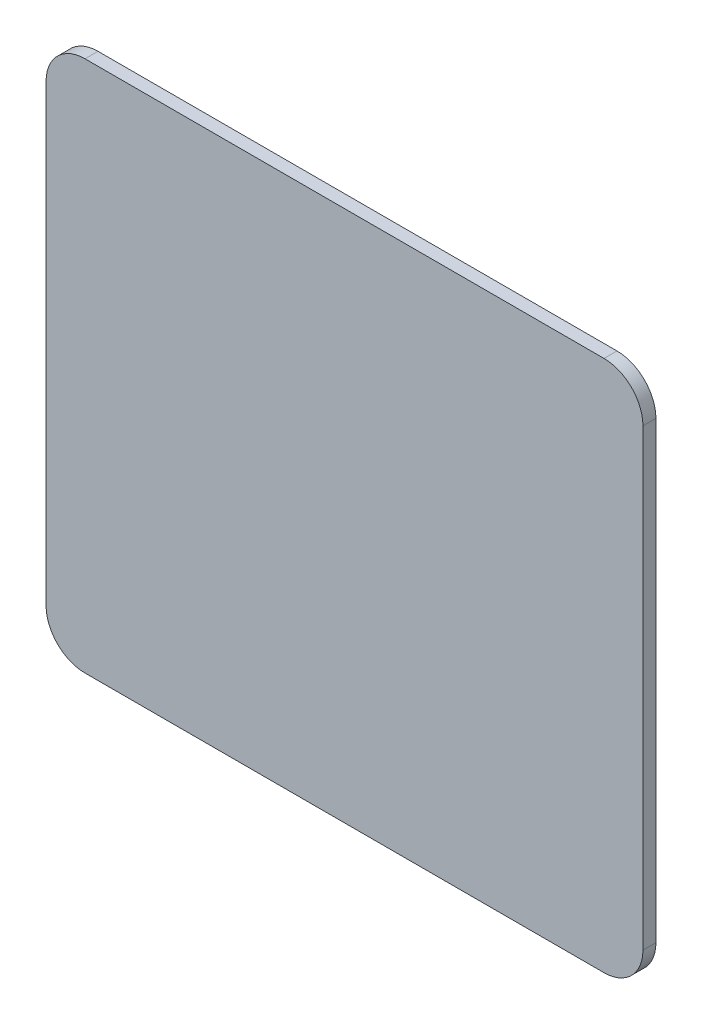
ISO-10303-21;
HEADER;
FILE_DESCRIPTION(('STEP AP214'),'2;1');
FILE_NAME('part.step','',(''),(''),'','','');
FILE_SCHEMA(('AUTOMOTIVE_DESIGN { 1 0 10303 214 1 1 1 1 }'));
ENDSEC;
DATA;
#1=APPLICATION_CONTEXT('core data for automotive mechanical design processes');
#2=APPLICATION_PROTOCOL_DEFINITION('international standard','automotive_design',2000,#1);
#3=PRODUCT_CONTEXT('',#1,'mechanical');
#4=PRODUCT('Part','Part','',(#3));
#5=PRODUCT_RELATED_PRODUCT_CATEGORY('part','',(#4));
#6=PRODUCT_DEFINITION_FORMATION('','',#4);
#7=PRODUCT_DEFINITION_CONTEXT('part definition',#1,'design');
#8=PRODUCT_DEFINITION('design','',#6,#7);
#9=PRODUCT_DEFINITION_SHAPE('','',#8);
#10=(LENGTH_UNIT() NAMED_UNIT(*) SI_UNIT(.MILLI.,.METRE.));
#11=(NAMED_UNIT(*) PLANE_ANGLE_UNIT() SI_UNIT($,.RADIAN.));
#12=(NAMED_UNIT(*) SI_UNIT($,.STERADIAN.) SOLID_ANGLE_UNIT());
#13=UNCERTAINTY_MEASURE_WITH_UNIT(LENGTH_MEASURE(1.E-05),#10,'distance_accuracy_value','');
#14=(GEOMETRIC_REPRESENTATION_CONTEXT(3) GLOBAL_UNCERTAINTY_ASSIGNED_CONTEXT((#13)) GLOBAL_UNIT_ASSIGNED_CONTEXT((#10,
#11,#12)) REPRESENTATION_CONTEXT('',''));
#15=CARTESIAN_POINT('',(0.,0.,0.));
#16=DIRECTION('',(0.,0.,1.));
#17=DIRECTION('',(1.,0.,0.));
#18=AXIS2_PLACEMENT_3D('',#15,#16,#17);
#19=CARTESIAN_POINT('',(-19.1581938186555,19.0251729813199,1.));
#20=DIRECTION('',(0.,0.,-1.));
#21=DIRECTION('',(-1.,0.,0.));
#22=AXIS2_PLACEMENT_3D('',#19,#20,#21);
#23=CYLINDRICAL_SURFACE('',#22,2.99999999999991);
#24=CARTESIAN_POINT('',(-19.1581938186555,19.0251729813199,0.));
#25=DIRECTION('',(0.,0.,1.));
#26=DIRECTION('',(-1.,0.,0.));
#27=AXIS2_PLACEMENT_3D('',#24,#25,#26);
#28=CIRCLE('',#27,2.99999999999991);
#29=CARTESIAN_POINT('',(-19.1581938186555,22.0251729813198,0.));
#30=VERTEX_POINT('',#29);
#31=CARTESIAN_POINT('',(-22.1581938186554,19.0251729813199,0.));
#32=VERTEX_POINT('',#31);
#33=EDGE_CURVE('E144',#30,#32,#28,.T.);
#34=ORIENTED_EDGE('',*,*,#33,.T.);
#35=DIRECTION('',(0.,0.,-1.));
#36=VECTOR('',#35,1.);
#37=CARTESIAN_POINT('',(-22.1581938186554,19.0251729813199,1.));
#38=LINE('',#37,#36);
#39=CARTESIAN_POINT('',(-22.1581938186554,19.0251729813199,1.));
#40=VERTEX_POINT('',#39);
#41=EDGE_CURVE('E11',#40,#32,#38,.T.);
#42=ORIENTED_EDGE('',*,*,#41,.F.);
#43=CARTESIAN_POINT('',(-19.1581938186555,19.0251729813199,1.));
#44=DIRECTION('',(0.,0.,1.));
#45=DIRECTION('',(-1.,0.,0.));
#46=AXIS2_PLACEMENT_3D('',#43,#44,#45);
#47=CIRCLE('',#46,2.99999999999991);
#48=CARTESIAN_POINT('',(-19.1581938186555,22.0251729813198,1.));
#49=VERTEX_POINT('',#48);
#50=EDGE_CURVE('E166',#49,#40,#47,.T.);
#51=ORIENTED_EDGE('',*,*,#50,.F.);
#52=DIRECTION('',(0.,0.,-1.));
#53=VECTOR('',#52,1.);
#54=CARTESIAN_POINT('',(-19.1581938186555,22.0251729813198,1.));
#55=LINE('',#54,#53);
#56=EDGE_CURVE('E140',#49,#30,#55,.T.);
#57=ORIENTED_EDGE('',*,*,#56,.T.);
#58=EDGE_LOOP('',(#34,#42,#51,#57));
#59=FACE_BOUND('',#58,.T.);
#60=ADVANCED_FACE('F43',(#59),#23,.T.);
#61=CARTESIAN_POINT('',(-22.1581938186554,19.0251729813199,1.));
#62=DIRECTION('',(1.,0.,0.));
#63=DIRECTION('',(0.,1.,0.));
#64=AXIS2_PLACEMENT_3D('',#61,#62,#63);
#65=PLANE('',#64);
#66=DIRECTION('',(0.,-1.,0.));
#67=VECTOR('',#66,1.);
#68=CARTESIAN_POINT('',(-22.1581938186554,19.0251729813199,0.));
#69=LINE('',#68,#67);
#70=CARTESIAN_POINT('',(-22.1581938186554,-15.9748270186802,0.));
#71=VERTEX_POINT('',#70);
#72=EDGE_CURVE('E148',#32,#71,#69,.T.);
#73=ORIENTED_EDGE('',*,*,#72,.T.);
#74=DIRECTION('',(0.,0.,-1.));
#75=VECTOR('',#74,1.);
#76=CARTESIAN_POINT('',(-22.1581938186554,-15.9748270186802,1.));
#77=LINE('',#76,#75);
#78=CARTESIAN_POINT('',(-22.1581938186554,-15.9748270186802,1.));
#79=VERTEX_POINT('',#78);
#80=EDGE_CURVE('E52',#79,#71,#77,.T.);
#81=ORIENTED_EDGE('',*,*,#80,.F.);
#82=DIRECTION('',(0.,-1.,0.));
#83=VECTOR('',#82,1.);
#84=CARTESIAN_POINT('',(-22.1581938186554,19.0251729813199,1.));
#85=LINE('',#84,#83);
#86=EDGE_CURVE('E103',#40,#79,#85,.T.);
#87=ORIENTED_EDGE('',*,*,#86,.F.);
#88=ORIENTED_EDGE('',*,*,#41,.T.);
#89=EDGE_LOOP('',(#73,#81,#87,#88));
#90=FACE_BOUND('',#89,.T.);
#91=ADVANCED_FACE('F212',(#90),#65,.F.);
#92=CARTESIAN_POINT('',(-19.1581938186554,-15.9748270186802,1.));
#93=DIRECTION('',(0.,0.,-1.));
#94=DIRECTION('',(-1.,0.,0.));
#95=AXIS2_PLACEMENT_3D('',#92,#93,#94);
#96=CYLINDRICAL_SURFACE('',#95,3.);
#97=CARTESIAN_POINT('',(-19.1581938186554,-15.9748270186802,0.));
#98=DIRECTION('',(0.,0.,1.));
#99=DIRECTION('',(-1.,0.,0.));
#100=AXIS2_PLACEMENT_3D('',#97,#98,#99);
#101=CIRCLE('',#100,3.);
#102=CARTESIAN_POINT('',(-19.1581938186554,-18.9748270186802,0.));
#103=VERTEX_POINT('',#102);
#104=EDGE_CURVE('E151',#71,#103,#101,.T.);
#105=ORIENTED_EDGE('',*,*,#104,.T.);
#106=DIRECTION('',(0.,0.,-1.));
#107=VECTOR('',#106,1.);
#108=CARTESIAN_POINT('',(-19.1581938186554,-18.9748270186802,1.));
#109=LINE('',#108,#107);
#110=CARTESIAN_POINT('',(-19.1581938186554,-18.9748270186802,1.));
#111=VERTEX_POINT('',#110);
#112=EDGE_CURVE('E177',#111,#103,#109,.T.);
#113=ORIENTED_EDGE('',*,*,#112,.F.);
#114=CARTESIAN_POINT('',(-19.1581938186554,-15.9748270186802,1.));
#115=DIRECTION('',(0.,0.,1.));
#116=DIRECTION('',(-1.,0.,0.));
#117=AXIS2_PLACEMENT_3D('',#114,#115,#116);
#118=CIRCLE('',#117,3.);
#119=EDGE_CURVE('E187',#79,#111,#118,.T.);
#120=ORIENTED_EDGE('',*,*,#119,.F.);
#121=ORIENTED_EDGE('',*,*,#80,.T.);
#122=EDGE_LOOP('',(#105,#113,#120,#121));
#123=FACE_BOUND('',#122,.T.);
#124=ADVANCED_FACE('F185',(#123),#96,.T.);
#125=CARTESIAN_POINT('',(-19.1581938186554,-18.9748270186802,1.));
#126=DIRECTION('',(0.,1.,0.));
#127=DIRECTION('',(0.,0.,1.));
#128=AXIS2_PLACEMENT_3D('',#125,#126,#127);
#129=PLANE('',#128);
#130=DIRECTION('',(1.,0.,0.));
#131=VECTOR('',#130,1.);
#132=CARTESIAN_POINT('',(-19.1581938186554,-18.9748270186802,0.));
#133=LINE('',#132,#131);
#134=CARTESIAN_POINT('',(20.8418061813446,-18.9748270186802,0.));
#135=VERTEX_POINT('',#134);
#136=EDGE_CURVE('E154',#103,#135,#133,.T.);
#137=ORIENTED_EDGE('',*,*,#136,.T.);
#138=DIRECTION('',(0.,0.,-1.));
#139=VECTOR('',#138,1.);
#140=CARTESIAN_POINT('',(20.8418061813446,-18.9748270186802,1.));
#141=LINE('',#140,#139);
#142=CARTESIAN_POINT('',(20.8418061813446,-18.9748270186802,1.));
#143=VERTEX_POINT('',#142);
#144=EDGE_CURVE('E173',#143,#135,#141,.T.);
#145=ORIENTED_EDGE('',*,*,#144,.F.);
#146=DIRECTION('',(1.,0.,0.));
#147=VECTOR('',#146,1.);
#148=CARTESIAN_POINT('',(-19.1581938186554,-18.9748270186802,1.));
#149=LINE('',#148,#147);
#150=EDGE_CURVE('E200',#111,#143,#149,.T.);
#151=ORIENTED_EDGE('',*,*,#150,.F.);
#152=ORIENTED_EDGE('',*,*,#112,.T.);
#153=EDGE_LOOP('',(#137,#145,#151,#152));
#154=FACE_BOUND('',#153,.T.);
#155=ADVANCED_FACE('F195',(#154),#129,.F.);
#156=CARTESIAN_POINT('',(20.8418061813446,-15.9748270186802,1.));
#157=DIRECTION('',(0.,0.,-1.));
#158=DIRECTION('',(-1.,0.,0.));
#159=AXIS2_PLACEMENT_3D('',#156,#157,#158);
#160=CYLINDRICAL_SURFACE('',#159,3.00000000000001);
#161=CARTESIAN_POINT('',(20.8418061813446,-15.9748270186802,0.));
#162=DIRECTION('',(0.,0.,1.));
#163=DIRECTION('',(-1.,0.,0.));
#164=AXIS2_PLACEMENT_3D('',#161,#162,#163);
#165=CIRCLE('',#164,3.00000000000001);
#166=CARTESIAN_POINT('',(23.8418061813446,-15.9748270186802,0.));
#167=VERTEX_POINT('',#166);
#168=EDGE_CURVE('E157',#135,#167,#165,.T.);
#169=ORIENTED_EDGE('',*,*,#168,.T.);
#170=DIRECTION('',(0.,0.,-1.));
#171=VECTOR('',#170,1.);
#172=CARTESIAN_POINT('',(23.8418061813446,-15.9748270186802,1.));
#173=LINE('',#172,#171);
#174=CARTESIAN_POINT('',(23.8418061813446,-15.9748270186802,1.));
#175=VERTEX_POINT('',#174);
#176=EDGE_CURVE('E133',#175,#167,#173,.T.);
#177=ORIENTED_EDGE('',*,*,#176,.F.);
#178=CARTESIAN_POINT('',(20.8418061813446,-15.9748270186802,1.));
#179=DIRECTION('',(0.,0.,1.));
#180=DIRECTION('',(-1.,0.,0.));
#181=AXIS2_PLACEMENT_3D('',#178,#179,#180);
#182=CIRCLE('',#181,3.00000000000001);
#183=EDGE_CURVE('E122',#143,#175,#182,.T.);
#184=ORIENTED_EDGE('',*,*,#183,.F.);
#185=ORIENTED_EDGE('',*,*,#144,.T.);
#186=EDGE_LOOP('',(#169,#177,#184,#185));
#187=FACE_BOUND('',#186,.T.);
#188=ADVANCED_FACE('F198',(#187),#160,.T.);
#189=CARTESIAN_POINT('',(23.8418061813446,-15.9748270186802,1.));
#190=DIRECTION('',(-1.,0.,0.));
#191=DIRECTION('',(0.,0.,1.));
#192=AXIS2_PLACEMENT_3D('',#189,#190,#191);
#193=PLANE('',#192);
#194=DIRECTION('',(0.,1.,0.));
#195=VECTOR('',#194,1.);
#196=CARTESIAN_POINT('',(23.8418061813446,-15.9748270186802,0.));
#197=LINE('',#196,#195);
#198=CARTESIAN_POINT('',(23.8418061813446,19.0251729813198,0.));
#199=VERTEX_POINT('',#198);
#200=EDGE_CURVE('E131',#167,#199,#197,.T.);
#201=ORIENTED_EDGE('',*,*,#200,.T.);
#202=DIRECTION('',(0.,0.,-1.));
#203=VECTOR('',#202,1.);
#204=CARTESIAN_POINT('',(23.8418061813446,19.0251729813198,1.));
#205=LINE('',#204,#203);
#206=CARTESIAN_POINT('',(23.8418061813446,19.0251729813198,1.));
#207=VERTEX_POINT('',#206);
#208=EDGE_CURVE('E128',#207,#199,#205,.T.);
#209=ORIENTED_EDGE('',*,*,#208,.F.);
#210=DIRECTION('',(0.,1.,0.));
#211=VECTOR('',#210,1.);
#212=CARTESIAN_POINT('',(23.8418061813446,-15.9748270186802,1.));
#213=LINE('',#212,#211);
#214=EDGE_CURVE('E116',#175,#207,#213,.T.);
#215=ORIENTED_EDGE('',*,*,#214,.F.);
#216=ORIENTED_EDGE('',*,*,#176,.T.);
#217=EDGE_LOOP('',(#201,#209,#215,#216));
#218=FACE_BOUND('',#217,.T.);
#219=ADVANCED_FACE('F129',(#218),#193,.F.);
#220=CARTESIAN_POINT('',(20.8418061813446,19.0251729813198,1.));
#221=DIRECTION('',(0.,0.,-1.));
#222=DIRECTION('',(-1.,0.,0.));
#223=AXIS2_PLACEMENT_3D('',#220,#221,#222);
#224=CYLINDRICAL_SURFACE('',#223,3.00000000000004);
#225=CARTESIAN_POINT('',(20.8418061813446,19.0251729813198,0.));
#226=DIRECTION('',(0.,0.,1.));
#227=DIRECTION('',(-1.,0.,0.));
#228=AXIS2_PLACEMENT_3D('',#225,#226,#227);
#229=CIRCLE('',#228,3.00000000000004);
#230=CARTESIAN_POINT('',(20.8418061813446,22.0251729813198,0.));
#231=VERTEX_POINT('',#230);
#232=EDGE_CURVE('E89',#199,#231,#229,.T.);
#233=ORIENTED_EDGE('',*,*,#232,.T.);
#234=DIRECTION('',(0.,0.,-1.));
#235=VECTOR('',#234,1.);
#236=CARTESIAN_POINT('',(20.8418061813446,22.0251729813198,1.));
#237=LINE('',#236,#235);
#238=CARTESIAN_POINT('',(20.8418061813446,22.0251729813198,1.));
#239=VERTEX_POINT('',#238);
#240=EDGE_CURVE('E134',#239,#231,#237,.T.);
#241=ORIENTED_EDGE('',*,*,#240,.F.);
#242=CARTESIAN_POINT('',(20.8418061813446,19.0251729813198,1.));
#243=DIRECTION('',(0.,0.,1.));
#244=DIRECTION('',(-1.,0.,0.));
#245=AXIS2_PLACEMENT_3D('',#242,#243,#244);
#246=CIRCLE('',#245,3.00000000000004);
#247=EDGE_CURVE('E120',#207,#239,#246,.T.);
#248=ORIENTED_EDGE('',*,*,#247,.F.);
#249=ORIENTED_EDGE('',*,*,#208,.T.);
#250=EDGE_LOOP('',(#233,#241,#248,#249));
#251=FACE_BOUND('',#250,.T.);
#252=ADVANCED_FACE('F136',(#251),#224,.T.);
#253=CARTESIAN_POINT('',(20.8418061813446,22.0251729813198,1.));
#254=DIRECTION('',(0.,-1.,0.));
#255=DIRECTION('',(1.,0.,0.));
#256=AXIS2_PLACEMENT_3D('',#253,#254,#255);
#257=PLANE('',#256);
#258=DIRECTION('',(-1.,0.,0.));
#259=VECTOR('',#258,1.);
#260=CARTESIAN_POINT('',(20.8418061813446,22.0251729813198,0.));
#261=LINE('',#260,#259);
#262=EDGE_CURVE('E95',#231,#30,#261,.T.);
#263=ORIENTED_EDGE('',*,*,#262,.T.);
#264=ORIENTED_EDGE('',*,*,#56,.F.);
#265=DIRECTION('',(-1.,0.,0.));
#266=VECTOR('',#265,1.);
#267=CARTESIAN_POINT('',(20.8418061813446,22.0251729813198,1.));
#268=LINE('',#267,#266);
#269=EDGE_CURVE('E60',#239,#49,#268,.T.);
#270=ORIENTED_EDGE('',*,*,#269,.F.);
#271=ORIENTED_EDGE('',*,*,#240,.T.);
#272=EDGE_LOOP('',(#263,#264,#270,#271));
#273=FACE_BOUND('',#272,.T.);
#274=ADVANCED_FACE('F228',(#273),#257,.F.);
#275=CARTESIAN_POINT('',(-19.1581938186555,19.0251729813199,1.));
#276=DIRECTION('',(0.,0.,-1.));
#277=DIRECTION('',(-1.,0.,0.));
#278=AXIS2_PLACEMENT_3D('',#275,#276,#277);
#279=PLANE('',#278);
#280=ORIENTED_EDGE('',*,*,#50,.T.);
#281=ORIENTED_EDGE('',*,*,#86,.T.);
#282=ORIENTED_EDGE('',*,*,#119,.T.);
#283=ORIENTED_EDGE('',*,*,#150,.T.);
#284=ORIENTED_EDGE('',*,*,#183,.T.);
#285=ORIENTED_EDGE('',*,*,#214,.T.);
#286=ORIENTED_EDGE('',*,*,#247,.T.);
#287=ORIENTED_EDGE('',*,*,#269,.T.);
#288=EDGE_LOOP('',(#280,#281,#282,#283,#284,#285,#286,#287));
#289=FACE_BOUND('',#288,.T.);
#290=ADVANCED_FACE('F118',(#289),#279,.F.);
#291=CARTESIAN_POINT('',(-19.1581938186555,19.0251729813199,0.));
#292=DIRECTION('',(0.,0.,-1.));
#293=DIRECTION('',(-1.,0.,0.));
#294=AXIS2_PLACEMENT_3D('',#291,#292,#293);
#295=PLANE('',#294);
#296=ORIENTED_EDGE('',*,*,#33,.F.);
#297=ORIENTED_EDGE('',*,*,#262,.F.);
#298=ORIENTED_EDGE('',*,*,#232,.F.);
#299=ORIENTED_EDGE('',*,*,#200,.F.);
#300=ORIENTED_EDGE('',*,*,#168,.F.);
#301=ORIENTED_EDGE('',*,*,#136,.F.);
#302=ORIENTED_EDGE('',*,*,#104,.F.);
#303=ORIENTED_EDGE('',*,*,#72,.F.);
#304=EDGE_LOOP('',(#296,#297,#298,#299,#300,#301,#302,#303));
#305=FACE_BOUND('',#304,.T.);
#306=ADVANCED_FACE('F191',(#305),#295,.T.);
#307=CLOSED_SHELL('',(#60,#91,#124,#155,#188,#219,#252,#274,#290,#306));
#308=MANIFOLD_SOLID_BREP('B2',#307);
#309=ADVANCED_BREP_SHAPE_REPRESENTATION('',(#18,#308),#14);
#310=SHAPE_DEFINITION_REPRESENTATION(#9,#309);
ENDSEC;
END-ISO-10303-21;
